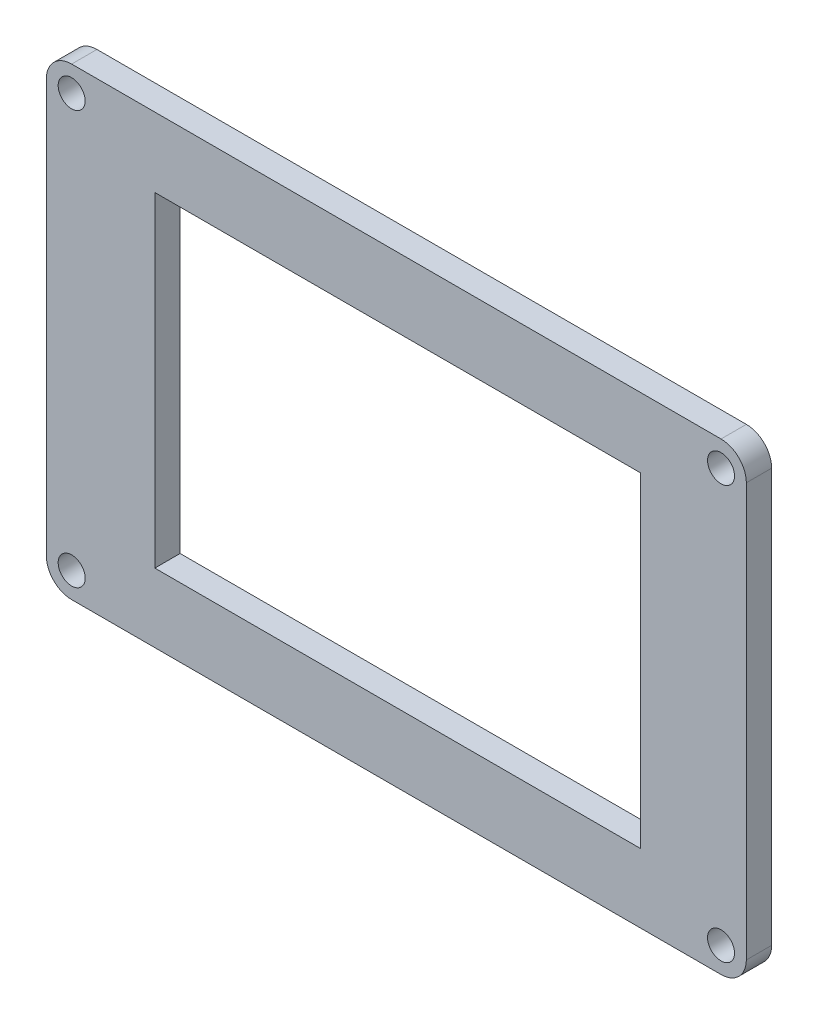
ISO-10303-21;
HEADER;
FILE_DESCRIPTION(('STEP AP214'),'2;1');
FILE_NAME('part.step','',(''),(''),'','','');
FILE_SCHEMA(('AUTOMOTIVE_DESIGN { 1 0 10303 214 1 1 1 1 }'));
ENDSEC;
DATA;
#1=APPLICATION_CONTEXT('core data for automotive mechanical design processes');
#2=APPLICATION_PROTOCOL_DEFINITION('international standard','automotive_design',2000,#1);
#3=PRODUCT_CONTEXT('',#1,'mechanical');
#4=PRODUCT('Part','Part','',(#3));
#5=PRODUCT_RELATED_PRODUCT_CATEGORY('part','',(#4));
#6=PRODUCT_DEFINITION_FORMATION('','',#4);
#7=PRODUCT_DEFINITION_CONTEXT('part definition',#1,'design');
#8=PRODUCT_DEFINITION('design','',#6,#7);
#9=PRODUCT_DEFINITION_SHAPE('','',#8);
#10=(LENGTH_UNIT() NAMED_UNIT(*) SI_UNIT(.MILLI.,.METRE.));
#11=(NAMED_UNIT(*) PLANE_ANGLE_UNIT() SI_UNIT($,.RADIAN.));
#12=(NAMED_UNIT(*) SI_UNIT($,.STERADIAN.) SOLID_ANGLE_UNIT());
#13=UNCERTAINTY_MEASURE_WITH_UNIT(LENGTH_MEASURE(1.E-05),#10,'distance_accuracy_value','');
#14=(GEOMETRIC_REPRESENTATION_CONTEXT(3) GLOBAL_UNCERTAINTY_ASSIGNED_CONTEXT((#13)) GLOBAL_UNIT_ASSIGNED_CONTEXT((#10,
#11,#12)) REPRESENTATION_CONTEXT('',''));
#15=CARTESIAN_POINT('',(0.,0.,0.));
#16=DIRECTION('',(0.,0.,1.));
#17=DIRECTION('',(1.,0.,0.));
#18=AXIS2_PLACEMENT_3D('',#15,#16,#17);
#19=CARTESIAN_POINT('',(0.,-49.,3.));
#20=DIRECTION('',(0.,0.,-1.));
#21=DIRECTION('',(-1.,0.,0.));
#22=AXIS2_PLACEMENT_3D('',#19,#20,#21);
#23=PLANE('',#22);
#24=DIRECTION('',(1.,0.,0.));
#25=VECTOR('',#24,1.);
#26=CARTESIAN_POINT('',(9.86033006462521,-43.8308616932729,3.));
#27=LINE('',#26,#25);
#28=CARTESIAN_POINT('',(9.86033006462521,-43.8308616932729,3.));
#29=VERTEX_POINT('',#28);
#30=CARTESIAN_POINT('',(67.4644006796389,-43.8308616932729,3.));
#31=VERTEX_POINT('',#30);
#32=EDGE_CURVE('E146',#29,#31,#27,.T.);
#33=ORIENTED_EDGE('',*,*,#32,.F.);
#34=DIRECTION('',(0.,-1.,0.));
#35=VECTOR('',#34,1.);
#36=CARTESIAN_POINT('',(9.86033006462521,-43.8308616932729,3.));
#37=LINE('',#36,#35);
#38=CARTESIAN_POINT('',(9.86033006462521,-5.25670726357624,3.));
#39=VERTEX_POINT('',#38);
#40=EDGE_CURVE('E60',#39,#29,#37,.T.);
#41=ORIENTED_EDGE('',*,*,#40,.F.);
#42=DIRECTION('',(-1.,0.,0.));
#43=VECTOR('',#42,1.);
#44=CARTESIAN_POINT('',(9.86033006462521,-5.25670726357624,3.));
#45=LINE('',#44,#43);
#46=CARTESIAN_POINT('',(67.4644006796389,-5.25670726357624,3.));
#47=VERTEX_POINT('',#46);
#48=EDGE_CURVE('E153',#47,#39,#45,.T.);
#49=ORIENTED_EDGE('',*,*,#48,.F.);
#50=DIRECTION('',(0.,1.,0.));
#51=VECTOR('',#50,1.);
#52=CARTESIAN_POINT('',(67.4644006796389,-43.8308616932729,3.));
#53=LINE('',#52,#51);
#54=EDGE_CURVE('E136',#31,#47,#53,.T.);
#55=ORIENTED_EDGE('',*,*,#54,.F.);
#56=EDGE_LOOP('',(#33,#41,#49,#55));
#57=FACE_BOUND('',#56,.T.);
#58=CARTESIAN_POINT('',(77.,-49.,3.));
#59=DIRECTION('',(0.,0.,1.));
#60=DIRECTION('',(1.,0.,0.));
#61=AXIS2_PLACEMENT_3D('',#58,#59,#60);
#62=CIRCLE('',#61,1.60000000000001);
#63=CARTESIAN_POINT('',(78.6,-49.,3.));
#64=VERTEX_POINT('',#63);
#65=EDGE_CURVE('E168',#64,#64,#62,.T.);
#66=ORIENTED_EDGE('',*,*,#65,.F.);
#67=EDGE_LOOP('',(#66));
#68=FACE_BOUND('',#67,.T.);
#69=CARTESIAN_POINT('',(0.,-49.,3.));
#70=DIRECTION('',(0.,0.,1.));
#71=DIRECTION('',(1.,0.,0.));
#72=AXIS2_PLACEMENT_3D('',#69,#70,#71);
#73=CIRCLE('',#72,1.6);
#74=CARTESIAN_POINT('',(1.6,-49.,3.));
#75=VERTEX_POINT('',#74);
#76=EDGE_CURVE('E176',#75,#75,#73,.T.);
#77=ORIENTED_EDGE('',*,*,#76,.F.);
#78=EDGE_LOOP('',(#77));
#79=FACE_BOUND('',#78,.T.);
#80=CARTESIAN_POINT('',(77.,0.,3.));
#81=DIRECTION('',(0.,0.,1.));
#82=DIRECTION('',(1.,0.,0.));
#83=AXIS2_PLACEMENT_3D('',#80,#81,#82);
#84=CIRCLE('',#83,1.60000000000001);
#85=CARTESIAN_POINT('',(78.6,0.,3.));
#86=VERTEX_POINT('',#85);
#87=EDGE_CURVE('E184',#86,#86,#84,.T.);
#88=ORIENTED_EDGE('',*,*,#87,.F.);
#89=EDGE_LOOP('',(#88));
#90=FACE_BOUND('',#89,.T.);
#91=CARTESIAN_POINT('',(0.,0.,3.));
#92=DIRECTION('',(0.,0.,1.));
#93=DIRECTION('',(1.,0.,0.));
#94=AXIS2_PLACEMENT_3D('',#91,#92,#93);
#95=CIRCLE('',#94,1.6);
#96=CARTESIAN_POINT('',(1.6,0.,3.));
#97=VERTEX_POINT('',#96);
#98=EDGE_CURVE('E192',#97,#97,#95,.T.);
#99=ORIENTED_EDGE('',*,*,#98,.F.);
#100=EDGE_LOOP('',(#99));
#101=FACE_BOUND('',#100,.T.);
#102=CARTESIAN_POINT('',(0.,-49.,3.));
#103=DIRECTION('',(0.,0.,1.));
#104=DIRECTION('',(-1.,0.,0.));
#105=AXIS2_PLACEMENT_3D('',#102,#103,#104);
#106=CIRCLE('',#105,3.);
#107=CARTESIAN_POINT('',(-3.,-49.,3.));
#108=VERTEX_POINT('',#107);
#109=CARTESIAN_POINT('',(0.,-52.,3.));
#110=VERTEX_POINT('',#109);
#111=EDGE_CURVE('E200',#108,#110,#106,.T.);
#112=ORIENTED_EDGE('',*,*,#111,.T.);
#113=DIRECTION('',(1.,0.,0.));
#114=VECTOR('',#113,1.);
#115=CARTESIAN_POINT('',(0.,-52.,3.));
#116=LINE('',#115,#114);
#117=CARTESIAN_POINT('',(77.,-52.,3.));
#118=VERTEX_POINT('',#117);
#119=EDGE_CURVE('E204',#110,#118,#116,.T.);
#120=ORIENTED_EDGE('',*,*,#119,.T.);
#121=CARTESIAN_POINT('',(77.,-49.,3.));
#122=DIRECTION('',(0.,0.,1.));
#123=DIRECTION('',(1.,0.,0.));
#124=AXIS2_PLACEMENT_3D('',#121,#122,#123);
#125=CIRCLE('',#124,3.);
#126=CARTESIAN_POINT('',(80.,-49.,3.));
#127=VERTEX_POINT('',#126);
#128=EDGE_CURVE('E208',#118,#127,#125,.T.);
#129=ORIENTED_EDGE('',*,*,#128,.T.);
#130=DIRECTION('',(0.,1.,0.));
#131=VECTOR('',#130,1.);
#132=CARTESIAN_POINT('',(80.,-49.,3.));
#133=LINE('',#132,#131);
#134=CARTESIAN_POINT('',(80.,0.,3.));
#135=VERTEX_POINT('',#134);
#136=EDGE_CURVE('E211',#127,#135,#133,.T.);
#137=ORIENTED_EDGE('',*,*,#136,.T.);
#138=CARTESIAN_POINT('',(77.,0.,3.));
#139=DIRECTION('',(0.,0.,1.));
#140=DIRECTION('',(-1.,0.,0.));
#141=AXIS2_PLACEMENT_3D('',#138,#139,#140);
#142=CIRCLE('',#141,3.);
#143=CARTESIAN_POINT('',(77.,3.,3.));
#144=VERTEX_POINT('',#143);
#145=EDGE_CURVE('E214',#135,#144,#142,.T.);
#146=ORIENTED_EDGE('',*,*,#145,.T.);
#147=DIRECTION('',(-1.,0.,0.));
#148=VECTOR('',#147,1.);
#149=CARTESIAN_POINT('',(0.,3.,3.));
#150=LINE('',#149,#148);
#151=CARTESIAN_POINT('',(0.,3.,3.));
#152=VERTEX_POINT('',#151);
#153=EDGE_CURVE('E217',#144,#152,#150,.T.);
#154=ORIENTED_EDGE('',*,*,#153,.T.);
#155=CARTESIAN_POINT('',(0.,0.,3.));
#156=DIRECTION('',(0.,0.,1.));
#157=DIRECTION('',(-1.,0.,0.));
#158=AXIS2_PLACEMENT_3D('',#155,#156,#157);
#159=CIRCLE('',#158,3.);
#160=CARTESIAN_POINT('',(-3.,0.,3.));
#161=VERTEX_POINT('',#160);
#162=EDGE_CURVE('E220',#152,#161,#159,.T.);
#163=ORIENTED_EDGE('',*,*,#162,.T.);
#164=DIRECTION('',(0.,-1.,0.));
#165=VECTOR('',#164,1.);
#166=CARTESIAN_POINT('',(-3.,-49.,3.));
#167=LINE('',#166,#165);
#168=EDGE_CURVE('E223',#161,#108,#167,.T.);
#169=ORIENTED_EDGE('',*,*,#168,.T.);
#170=EDGE_LOOP('',(#112,#120,#129,#137,#146,#154,#163,#169));
#171=FACE_BOUND('',#170,.T.);
#172=ADVANCED_FACE('F44',(#57,#68,#79,#90,#101,#171),#23,.F.);
#173=CARTESIAN_POINT('',(0.,-49.,0.));
#174=DIRECTION('',(0.,0.,-1.));
#175=DIRECTION('',(-1.,0.,0.));
#176=AXIS2_PLACEMENT_3D('',#173,#174,#175);
#177=PLANE('',#176);
#178=DIRECTION('',(0.,1.,0.));
#179=VECTOR('',#178,1.);
#180=CARTESIAN_POINT('',(9.86033006462521,-49.,0.));
#181=LINE('',#180,#179);
#182=CARTESIAN_POINT('',(9.86033006462521,-43.8308616932729,0.));
#183=VERTEX_POINT('',#182);
#184=CARTESIAN_POINT('',(9.86033006462521,-5.25670726357624,0.));
#185=VERTEX_POINT('',#184);
#186=EDGE_CURVE('E11',#183,#185,#181,.T.);
#187=ORIENTED_EDGE('',*,*,#186,.F.);
#188=DIRECTION('',(-1.,0.,0.));
#189=VECTOR('',#188,1.);
#190=CARTESIAN_POINT('',(0.,-43.8308616932729,0.));
#191=LINE('',#190,#189);
#192=CARTESIAN_POINT('',(67.4644006796389,-43.8308616932729,0.));
#193=VERTEX_POINT('',#192);
#194=EDGE_CURVE('E281',#193,#183,#191,.T.);
#195=ORIENTED_EDGE('',*,*,#194,.F.);
#196=DIRECTION('',(0.,-1.,0.));
#197=VECTOR('',#196,1.);
#198=CARTESIAN_POINT('',(67.4644006796389,-49.,0.));
#199=LINE('',#198,#197);
#200=CARTESIAN_POINT('',(67.4644006796389,-5.25670726357624,0.));
#201=VERTEX_POINT('',#200);
#202=EDGE_CURVE('E139',#201,#193,#199,.T.);
#203=ORIENTED_EDGE('',*,*,#202,.F.);
#204=DIRECTION('',(1.,0.,0.));
#205=VECTOR('',#204,1.);
#206=CARTESIAN_POINT('',(0.,-5.25670726357624,0.));
#207=LINE('',#206,#205);
#208=EDGE_CURVE('E53',#185,#201,#207,.T.);
#209=ORIENTED_EDGE('',*,*,#208,.F.);
#210=EDGE_LOOP('',(#187,#195,#203,#209));
#211=FACE_BOUND('',#210,.T.);
#212=CARTESIAN_POINT('',(0.,-49.,0.));
#213=DIRECTION('',(0.,0.,1.));
#214=DIRECTION('',(1.,0.,0.));
#215=AXIS2_PLACEMENT_3D('',#212,#213,#214);
#216=CIRCLE('',#215,1.6);
#217=CARTESIAN_POINT('',(1.6,-49.,0.));
#218=VERTEX_POINT('',#217);
#219=EDGE_CURVE('E172',#218,#218,#216,.T.);
#220=ORIENTED_EDGE('',*,*,#219,.T.);
#221=EDGE_LOOP('',(#220));
#222=FACE_BOUND('',#221,.T.);
#223=CARTESIAN_POINT('',(0.,0.,0.));
#224=DIRECTION('',(0.,0.,1.));
#225=DIRECTION('',(1.,0.,0.));
#226=AXIS2_PLACEMENT_3D('',#223,#224,#225);
#227=CIRCLE('',#226,1.6);
#228=CARTESIAN_POINT('',(1.6,0.,0.));
#229=VERTEX_POINT('',#228);
#230=EDGE_CURVE('E188',#229,#229,#227,.T.);
#231=ORIENTED_EDGE('',*,*,#230,.T.);
#232=EDGE_LOOP('',(#231));
#233=FACE_BOUND('',#232,.T.);
#234=CARTESIAN_POINT('',(0.,-49.,0.));
#235=DIRECTION('',(0.,0.,1.));
#236=DIRECTION('',(-1.,0.,0.));
#237=AXIS2_PLACEMENT_3D('',#234,#235,#236);
#238=CIRCLE('',#237,3.);
#239=CARTESIAN_POINT('',(-3.,-49.,0.));
#240=VERTEX_POINT('',#239);
#241=CARTESIAN_POINT('',(0.,-52.,0.));
#242=VERTEX_POINT('',#241);
#243=EDGE_CURVE('E196',#240,#242,#238,.T.);
#244=ORIENTED_EDGE('',*,*,#243,.F.);
#245=DIRECTION('',(0.,-1.,0.));
#246=VECTOR('',#245,1.);
#247=CARTESIAN_POINT('',(-3.,-49.,0.));
#248=LINE('',#247,#246);
#249=CARTESIAN_POINT('',(-3.,0.,0.));
#250=VERTEX_POINT('',#249);
#251=EDGE_CURVE('E205',#250,#240,#248,.T.);
#252=ORIENTED_EDGE('',*,*,#251,.F.);
#253=CARTESIAN_POINT('',(0.,0.,0.));
#254=DIRECTION('',(0.,0.,1.));
#255=DIRECTION('',(-1.,0.,0.));
#256=AXIS2_PLACEMENT_3D('',#253,#254,#255);
#257=CIRCLE('',#256,3.);
#258=CARTESIAN_POINT('',(0.,3.,0.));
#259=VERTEX_POINT('',#258);
#260=EDGE_CURVE('E245',#259,#250,#257,.T.);
#261=ORIENTED_EDGE('',*,*,#260,.F.);
#262=DIRECTION('',(-1.,0.,0.));
#263=VECTOR('',#262,1.);
#264=CARTESIAN_POINT('',(0.,3.,0.));
#265=LINE('',#264,#263);
#266=CARTESIAN_POINT('',(77.,3.,0.));
#267=VERTEX_POINT('',#266);
#268=EDGE_CURVE('E242',#267,#259,#265,.T.);
#269=ORIENTED_EDGE('',*,*,#268,.F.);
#270=CARTESIAN_POINT('',(77.,0.,0.));
#271=DIRECTION('',(0.,0.,1.));
#272=DIRECTION('',(-1.,0.,0.));
#273=AXIS2_PLACEMENT_3D('',#270,#271,#272);
#274=CIRCLE('',#273,3.);
#275=CARTESIAN_POINT('',(80.,0.,0.));
#276=VERTEX_POINT('',#275);
#277=EDGE_CURVE('E239',#276,#267,#274,.T.);
#278=ORIENTED_EDGE('',*,*,#277,.F.);
#279=DIRECTION('',(0.,1.,0.));
#280=VECTOR('',#279,1.);
#281=CARTESIAN_POINT('',(80.,-49.,0.));
#282=LINE('',#281,#280);
#283=CARTESIAN_POINT('',(80.,-49.,0.));
#284=VERTEX_POINT('',#283);
#285=EDGE_CURVE('E236',#284,#276,#282,.T.);
#286=ORIENTED_EDGE('',*,*,#285,.F.);
#287=CARTESIAN_POINT('',(77.,-49.,0.));
#288=DIRECTION('',(0.,0.,1.));
#289=DIRECTION('',(1.,0.,0.));
#290=AXIS2_PLACEMENT_3D('',#287,#288,#289);
#291=CIRCLE('',#290,3.);
#292=CARTESIAN_POINT('',(77.,-52.,0.));
#293=VERTEX_POINT('',#292);
#294=EDGE_CURVE('E233',#293,#284,#291,.T.);
#295=ORIENTED_EDGE('',*,*,#294,.F.);
#296=DIRECTION('',(1.,0.,0.));
#297=VECTOR('',#296,1.);
#298=CARTESIAN_POINT('',(0.,-52.,0.));
#299=LINE('',#298,#297);
#300=EDGE_CURVE('E230',#242,#293,#299,.T.);
#301=ORIENTED_EDGE('',*,*,#300,.F.);
#302=EDGE_LOOP('',(#244,#252,#261,#269,#278,#286,#295,#301));
#303=FACE_BOUND('',#302,.T.);
#304=CARTESIAN_POINT('',(77.,0.,0.));
#305=DIRECTION('',(0.,0.,1.));
#306=DIRECTION('',(1.,0.,0.));
#307=AXIS2_PLACEMENT_3D('',#304,#305,#306);
#308=CIRCLE('',#307,1.60000000000001);
#309=CARTESIAN_POINT('',(78.6,0.,0.));
#310=VERTEX_POINT('',#309);
#311=EDGE_CURVE('E180',#310,#310,#308,.T.);
#312=ORIENTED_EDGE('',*,*,#311,.T.);
#313=EDGE_LOOP('',(#312));
#314=FACE_BOUND('',#313,.T.);
#315=CARTESIAN_POINT('',(77.,-49.,0.));
#316=DIRECTION('',(0.,0.,1.));
#317=DIRECTION('',(1.,0.,0.));
#318=AXIS2_PLACEMENT_3D('',#315,#316,#317);
#319=CIRCLE('',#318,1.60000000000001);
#320=CARTESIAN_POINT('',(78.6,-49.,0.));
#321=VERTEX_POINT('',#320);
#322=EDGE_CURVE('E163',#321,#321,#319,.T.);
#323=ORIENTED_EDGE('',*,*,#322,.T.);
#324=EDGE_LOOP('',(#323));
#325=FACE_BOUND('',#324,.T.);
#326=ADVANCED_FACE('F292',(#211,#222,#233,#303,#314,#325),#177,.T.);
#327=CARTESIAN_POINT('',(0.,-49.,3.));
#328=DIRECTION('',(0.,0.,-1.));
#329=DIRECTION('',(-1.,0.,0.));
#330=AXIS2_PLACEMENT_3D('',#327,#328,#329);
#331=CYLINDRICAL_SURFACE('',#330,3.);
#332=ORIENTED_EDGE('',*,*,#243,.T.);
#333=DIRECTION('',(0.,0.,-1.));
#334=VECTOR('',#333,1.);
#335=CARTESIAN_POINT('',(0.,-52.,3.));
#336=LINE('',#335,#334);
#337=EDGE_CURVE('E277',#110,#242,#336,.T.);
#338=ORIENTED_EDGE('',*,*,#337,.F.);
#339=ORIENTED_EDGE('',*,*,#111,.F.);
#340=DIRECTION('',(0.,0.,-1.));
#341=VECTOR('',#340,1.);
#342=CARTESIAN_POINT('',(-3.,-49.,3.));
#343=LINE('',#342,#341);
#344=EDGE_CURVE('E226',#108,#240,#343,.T.);
#345=ORIENTED_EDGE('',*,*,#344,.T.);
#346=EDGE_LOOP('',(#332,#338,#339,#345));
#347=FACE_BOUND('',#346,.T.);
#348=ADVANCED_FACE('F46',(#347),#331,.T.);
#349=CARTESIAN_POINT('',(0.,-52.,3.));
#350=DIRECTION('',(0.,1.,0.));
#351=DIRECTION('',(0.,0.,1.));
#352=AXIS2_PLACEMENT_3D('',#349,#350,#351);
#353=PLANE('',#352);
#354=ORIENTED_EDGE('',*,*,#300,.T.);
#355=DIRECTION('',(0.,0.,-1.));
#356=VECTOR('',#355,1.);
#357=CARTESIAN_POINT('',(77.,-52.,3.));
#358=LINE('',#357,#356);
#359=EDGE_CURVE('E273',#118,#293,#358,.T.);
#360=ORIENTED_EDGE('',*,*,#359,.F.);
#361=ORIENTED_EDGE('',*,*,#119,.F.);
#362=ORIENTED_EDGE('',*,*,#337,.T.);
#363=EDGE_LOOP('',(#354,#360,#361,#362));
#364=FACE_BOUND('',#363,.T.);
#365=ADVANCED_FACE('F340',(#364),#353,.F.);
#366=CARTESIAN_POINT('',(77.,-49.,3.));
#367=DIRECTION('',(0.,0.,-1.));
#368=DIRECTION('',(-1.,0.,0.));
#369=AXIS2_PLACEMENT_3D('',#366,#367,#368);
#370=CYLINDRICAL_SURFACE('',#369,3.);
#371=ORIENTED_EDGE('',*,*,#294,.T.);
#372=DIRECTION('',(0.,0.,-1.));
#373=VECTOR('',#372,1.);
#374=CARTESIAN_POINT('',(80.,-49.,3.));
#375=LINE('',#374,#373);
#376=EDGE_CURVE('E269',#127,#284,#375,.T.);
#377=ORIENTED_EDGE('',*,*,#376,.F.);
#378=ORIENTED_EDGE('',*,*,#128,.F.);
#379=ORIENTED_EDGE('',*,*,#359,.T.);
#380=EDGE_LOOP('',(#371,#377,#378,#379));
#381=FACE_BOUND('',#380,.T.);
#382=ADVANCED_FACE('F337',(#381),#370,.T.);
#383=CARTESIAN_POINT('',(80.,-49.,3.));
#384=DIRECTION('',(-1.,0.,0.));
#385=DIRECTION('',(0.,0.,1.));
#386=AXIS2_PLACEMENT_3D('',#383,#384,#385);
#387=PLANE('',#386);
#388=ORIENTED_EDGE('',*,*,#285,.T.);
#389=DIRECTION('',(0.,0.,-1.));
#390=VECTOR('',#389,1.);
#391=CARTESIAN_POINT('',(80.,0.,3.));
#392=LINE('',#391,#390);
#393=EDGE_CURVE('E265',#135,#276,#392,.T.);
#394=ORIENTED_EDGE('',*,*,#393,.F.);
#395=ORIENTED_EDGE('',*,*,#136,.F.);
#396=ORIENTED_EDGE('',*,*,#376,.T.);
#397=EDGE_LOOP('',(#388,#394,#395,#396));
#398=FACE_BOUND('',#397,.T.);
#399=ADVANCED_FACE('F333',(#398),#387,.F.);
#400=CARTESIAN_POINT('',(77.,0.,3.));
#401=DIRECTION('',(0.,0.,-1.));
#402=DIRECTION('',(-1.,0.,0.));
#403=AXIS2_PLACEMENT_3D('',#400,#401,#402);
#404=CYLINDRICAL_SURFACE('',#403,3.);
#405=ORIENTED_EDGE('',*,*,#277,.T.);
#406=DIRECTION('',(0.,0.,-1.));
#407=VECTOR('',#406,1.);
#408=CARTESIAN_POINT('',(77.,3.,3.));
#409=LINE('',#408,#407);
#410=EDGE_CURVE('E261',#144,#267,#409,.T.);
#411=ORIENTED_EDGE('',*,*,#410,.F.);
#412=ORIENTED_EDGE('',*,*,#145,.F.);
#413=ORIENTED_EDGE('',*,*,#393,.T.);
#414=EDGE_LOOP('',(#405,#411,#412,#413));
#415=FACE_BOUND('',#414,.T.);
#416=ADVANCED_FACE('F329',(#415),#404,.T.);
#417=CARTESIAN_POINT('',(0.,3.,3.));
#418=DIRECTION('',(0.,-1.,0.));
#419=DIRECTION('',(1.,0.,0.));
#420=AXIS2_PLACEMENT_3D('',#417,#418,#419);
#421=PLANE('',#420);
#422=ORIENTED_EDGE('',*,*,#268,.T.);
#423=DIRECTION('',(0.,0.,-1.));
#424=VECTOR('',#423,1.);
#425=CARTESIAN_POINT('',(0.,3.,3.));
#426=LINE('',#425,#424);
#427=EDGE_CURVE('E257',#152,#259,#426,.T.);
#428=ORIENTED_EDGE('',*,*,#427,.F.);
#429=ORIENTED_EDGE('',*,*,#153,.F.);
#430=ORIENTED_EDGE('',*,*,#410,.T.);
#431=EDGE_LOOP('',(#422,#428,#429,#430));
#432=FACE_BOUND('',#431,.T.);
#433=ADVANCED_FACE('F325',(#432),#421,.F.);
#434=CARTESIAN_POINT('',(0.,0.,3.));
#435=DIRECTION('',(0.,0.,-1.));
#436=DIRECTION('',(-1.,0.,0.));
#437=AXIS2_PLACEMENT_3D('',#434,#435,#436);
#438=CYLINDRICAL_SURFACE('',#437,3.);
#439=ORIENTED_EDGE('',*,*,#260,.T.);
#440=DIRECTION('',(0.,0.,-1.));
#441=VECTOR('',#440,1.);
#442=CARTESIAN_POINT('',(-3.,0.,3.));
#443=LINE('',#442,#441);
#444=EDGE_CURVE('E253',#161,#250,#443,.T.);
#445=ORIENTED_EDGE('',*,*,#444,.F.);
#446=ORIENTED_EDGE('',*,*,#162,.F.);
#447=ORIENTED_EDGE('',*,*,#427,.T.);
#448=EDGE_LOOP('',(#439,#445,#446,#447));
#449=FACE_BOUND('',#448,.T.);
#450=ADVANCED_FACE('F321',(#449),#438,.T.);
#451=CARTESIAN_POINT('',(-3.,-49.,3.));
#452=DIRECTION('',(1.,0.,0.));
#453=DIRECTION('',(0.,0.,-1.));
#454=AXIS2_PLACEMENT_3D('',#451,#452,#453);
#455=PLANE('',#454);
#456=ORIENTED_EDGE('',*,*,#251,.T.);
#457=ORIENTED_EDGE('',*,*,#344,.F.);
#458=ORIENTED_EDGE('',*,*,#168,.F.);
#459=ORIENTED_EDGE('',*,*,#444,.T.);
#460=EDGE_LOOP('',(#456,#457,#458,#459));
#461=FACE_BOUND('',#460,.T.);
#462=ADVANCED_FACE('F318',(#461),#455,.F.);
#463=CARTESIAN_POINT('',(0.,0.,3.));
#464=DIRECTION('',(0.,0.,-1.));
#465=DIRECTION('',(-1.,0.,0.));
#466=AXIS2_PLACEMENT_3D('',#463,#464,#465);
#467=CYLINDRICAL_SURFACE('',#466,1.6);
#468=ORIENTED_EDGE('',*,*,#98,.T.);
#469=EDGE_LOOP('',(#468));
#470=FACE_BOUND('',#469,.T.);
#471=ORIENTED_EDGE('',*,*,#230,.F.);
#472=EDGE_LOOP('',(#471));
#473=FACE_BOUND('',#472,.T.);
#474=ADVANCED_FACE('F315',(#470,#473),#467,.F.);
#475=CARTESIAN_POINT('',(77.,0.,3.));
#476=DIRECTION('',(0.,0.,-1.));
#477=DIRECTION('',(-1.,0.,0.));
#478=AXIS2_PLACEMENT_3D('',#475,#476,#477);
#479=CYLINDRICAL_SURFACE('',#478,1.60000000000001);
#480=ORIENTED_EDGE('',*,*,#87,.T.);
#481=EDGE_LOOP('',(#480));
#482=FACE_BOUND('',#481,.T.);
#483=ORIENTED_EDGE('',*,*,#311,.F.);
#484=EDGE_LOOP('',(#483));
#485=FACE_BOUND('',#484,.T.);
#486=ADVANCED_FACE('F378',(#482,#485),#479,.F.);
#487=CARTESIAN_POINT('',(0.,-49.,3.));
#488=DIRECTION('',(0.,0.,-1.));
#489=DIRECTION('',(-1.,0.,0.));
#490=AXIS2_PLACEMENT_3D('',#487,#488,#489);
#491=CYLINDRICAL_SURFACE('',#490,1.6);
#492=ORIENTED_EDGE('',*,*,#76,.T.);
#493=EDGE_LOOP('',(#492));
#494=FACE_BOUND('',#493,.T.);
#495=ORIENTED_EDGE('',*,*,#219,.F.);
#496=EDGE_LOOP('',(#495));
#497=FACE_BOUND('',#496,.T.);
#498=ADVANCED_FACE('F305',(#494,#497),#491,.F.);
#499=CARTESIAN_POINT('',(77.,-49.,3.));
#500=DIRECTION('',(0.,0.,-1.));
#501=DIRECTION('',(-1.,0.,0.));
#502=AXIS2_PLACEMENT_3D('',#499,#500,#501);
#503=CYLINDRICAL_SURFACE('',#502,1.60000000000001);
#504=ORIENTED_EDGE('',*,*,#65,.T.);
#505=EDGE_LOOP('',(#504));
#506=FACE_BOUND('',#505,.T.);
#507=ORIENTED_EDGE('',*,*,#322,.F.);
#508=EDGE_LOOP('',(#507));
#509=FACE_BOUND('',#508,.T.);
#510=ADVANCED_FACE('F297',(#506,#509),#503,.F.);
#511=CARTESIAN_POINT('',(9.86033006462521,-43.8308616932729,-7.));
#512=DIRECTION('',(-1.,0.,0.));
#513=DIRECTION('',(0.,0.,1.));
#514=AXIS2_PLACEMENT_3D('',#511,#512,#513);
#515=PLANE('',#514);
#516=ORIENTED_EDGE('',*,*,#186,.T.);
#517=DIRECTION('',(0.,0.,1.));
#518=VECTOR('',#517,1.);
#519=CARTESIAN_POINT('',(9.86033006462521,-5.25670726357624,-7.));
#520=LINE('',#519,#518);
#521=EDGE_CURVE('E160',#185,#39,#520,.T.);
#522=ORIENTED_EDGE('',*,*,#521,.T.);
#523=ORIENTED_EDGE('',*,*,#40,.T.);
#524=DIRECTION('',(0.,0.,1.));
#525=VECTOR('',#524,1.);
#526=CARTESIAN_POINT('',(9.86033006462521,-43.8308616932729,-7.));
#527=LINE('',#526,#525);
#528=EDGE_CURVE('E143',#183,#29,#527,.T.);
#529=ORIENTED_EDGE('',*,*,#528,.F.);
#530=EDGE_LOOP('',(#516,#522,#523,#529));
#531=FACE_BOUND('',#530,.T.);
#532=ADVANCED_FACE('F294',(#531),#515,.F.);
#533=CARTESIAN_POINT('',(9.86033006462521,-5.25670726357624,-7.));
#534=DIRECTION('',(0.,1.,0.));
#535=DIRECTION('',(0.,0.,1.));
#536=AXIS2_PLACEMENT_3D('',#533,#534,#535);
#537=PLANE('',#536);
#538=ORIENTED_EDGE('',*,*,#208,.T.);
#539=DIRECTION('',(0.,0.,1.));
#540=VECTOR('',#539,1.);
#541=CARTESIAN_POINT('',(67.4644006796389,-5.25670726357624,-7.));
#542=LINE('',#541,#540);
#543=EDGE_CURVE('E142',#201,#47,#542,.T.);
#544=ORIENTED_EDGE('',*,*,#543,.T.);
#545=ORIENTED_EDGE('',*,*,#48,.T.);
#546=ORIENTED_EDGE('',*,*,#521,.F.);
#547=EDGE_LOOP('',(#538,#544,#545,#546));
#548=FACE_BOUND('',#547,.T.);
#549=ADVANCED_FACE('F289',(#548),#537,.F.);
#550=CARTESIAN_POINT('',(67.4644006796389,-43.8308616932729,-7.));
#551=DIRECTION('',(1.,0.,0.));
#552=DIRECTION('',(0.,0.,-1.));
#553=AXIS2_PLACEMENT_3D('',#550,#551,#552);
#554=PLANE('',#553);
#555=ORIENTED_EDGE('',*,*,#202,.T.);
#556=DIRECTION('',(0.,0.,1.));
#557=VECTOR('',#556,1.);
#558=CARTESIAN_POINT('',(67.4644006796389,-43.8308616932729,-7.));
#559=LINE('',#558,#557);
#560=EDGE_CURVE('E68',#193,#31,#559,.T.);
#561=ORIENTED_EDGE('',*,*,#560,.T.);
#562=ORIENTED_EDGE('',*,*,#54,.T.);
#563=ORIENTED_EDGE('',*,*,#543,.F.);
#564=EDGE_LOOP('',(#555,#561,#562,#563));
#565=FACE_BOUND('',#564,.T.);
#566=ADVANCED_FACE('F133',(#565),#554,.F.);
#567=CARTESIAN_POINT('',(9.86033006462521,-43.8308616932729,-7.));
#568=DIRECTION('',(0.,-1.,0.));
#569=DIRECTION('',(0.,0.,-1.));
#570=AXIS2_PLACEMENT_3D('',#567,#568,#569);
#571=PLANE('',#570);
#572=ORIENTED_EDGE('',*,*,#194,.T.);
#573=ORIENTED_EDGE('',*,*,#528,.T.);
#574=ORIENTED_EDGE('',*,*,#32,.T.);
#575=ORIENTED_EDGE('',*,*,#560,.F.);
#576=EDGE_LOOP('',(#572,#573,#574,#575));
#577=FACE_BOUND('',#576,.T.);
#578=ADVANCED_FACE('F147',(#577),#571,.F.);
#579=CLOSED_SHELL('',(#172,#326,#348,#365,#382,#399,#416,#433,#450,#462,#474,#486,#498,#510,
#532,#549,#566,#578));
#580=MANIFOLD_SOLID_BREP('B2',#579);
#581=ADVANCED_BREP_SHAPE_REPRESENTATION('',(#18,#580),#14);
#582=SHAPE_DEFINITION_REPRESENTATION(#9,#581);
ENDSEC;
END-ISO-10303-21;
